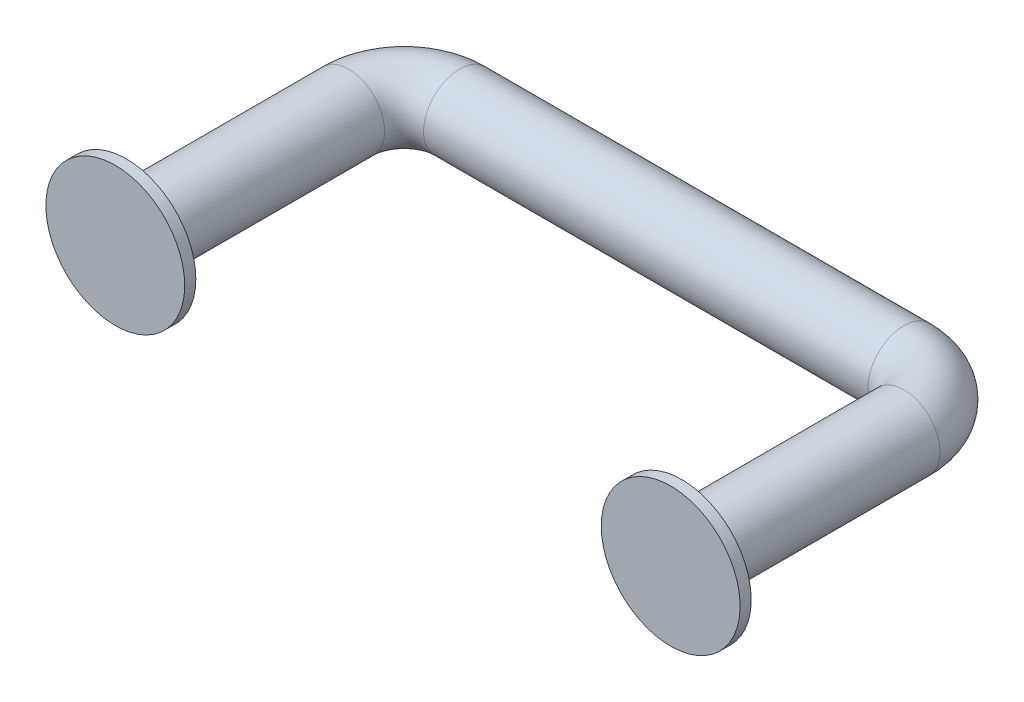
ISO-10303-21;
HEADER;
FILE_DESCRIPTION(('STEP AP214'),'2;1');
FILE_NAME('part.step','',(''),(''),'','','');
FILE_SCHEMA(('AUTOMOTIVE_DESIGN { 1 0 10303 214 1 1 1 1 }'));
ENDSEC;
DATA;
#1=APPLICATION_CONTEXT('core data for automotive mechanical design processes');
#2=APPLICATION_PROTOCOL_DEFINITION('international standard','automotive_design',2000,#1);
#3=PRODUCT_CONTEXT('',#1,'mechanical');
#4=PRODUCT('Part','Part','',(#3));
#5=PRODUCT_RELATED_PRODUCT_CATEGORY('part','',(#4));
#6=PRODUCT_DEFINITION_FORMATION('','',#4);
#7=PRODUCT_DEFINITION_CONTEXT('part definition',#1,'design');
#8=PRODUCT_DEFINITION('design','',#6,#7);
#9=PRODUCT_DEFINITION_SHAPE('','',#8);
#10=(LENGTH_UNIT() NAMED_UNIT(*) SI_UNIT(.MILLI.,.METRE.));
#11=(NAMED_UNIT(*) PLANE_ANGLE_UNIT() SI_UNIT($,.RADIAN.));
#12=(NAMED_UNIT(*) SI_UNIT($,.STERADIAN.) SOLID_ANGLE_UNIT());
#13=UNCERTAINTY_MEASURE_WITH_UNIT(LENGTH_MEASURE(1.E-05),#10,'distance_accuracy_value','');
#14=(GEOMETRIC_REPRESENTATION_CONTEXT(3) GLOBAL_UNCERTAINTY_ASSIGNED_CONTEXT((#13)) GLOBAL_UNIT_ASSIGNED_CONTEXT((#10,
#11,#12)) REPRESENTATION_CONTEXT('',''));
#15=CARTESIAN_POINT('',(0.,0.,0.));
#16=DIRECTION('',(0.,0.,1.));
#17=DIRECTION('',(1.,0.,0.));
#18=AXIS2_PLACEMENT_3D('',#15,#16,#17);
#19=CARTESIAN_POINT('',(50.,0.,52.));
#20=DIRECTION('',(0.,0.,-1.));
#21=DIRECTION('',(-1.,0.,0.));
#22=AXIS2_PLACEMENT_3D('',#19,#20,#21);
#23=CYLINDRICAL_SURFACE('',#22,12.5);
#24=CARTESIAN_POINT('',(50.,0.,52.));
#25=DIRECTION('',(0.,0.,1.));
#26=DIRECTION('',(-1.,0.,0.));
#27=AXIS2_PLACEMENT_3D('',#24,#25,#26);
#28=CIRCLE('',#27,12.5);
#29=CARTESIAN_POINT('',(37.5,0.,52.));
#30=VERTEX_POINT('',#29);
#31=EDGE_CURVE('E12',#30,#30,#28,.T.);
#32=ORIENTED_EDGE('',*,*,#31,.F.);
#33=EDGE_LOOP('',(#32));
#34=FACE_BOUND('',#33,.T.);
#35=CARTESIAN_POINT('',(50.,0.,50.));
#36=DIRECTION('',(0.,0.,1.));
#37=DIRECTION('',(-1.,0.,0.));
#38=AXIS2_PLACEMENT_3D('',#35,#36,#37);
#39=CIRCLE('',#38,12.5);
#40=CARTESIAN_POINT('',(37.5,0.,50.));
#41=VERTEX_POINT('',#40);
#42=EDGE_CURVE('E56',#41,#41,#39,.T.);
#43=ORIENTED_EDGE('',*,*,#42,.T.);
#44=EDGE_LOOP('',(#43));
#45=FACE_BOUND('',#44,.T.);
#46=ADVANCED_FACE('F53',(#34,#45),#23,.T.);
#47=CARTESIAN_POINT('',(50.,0.,52.));
#48=DIRECTION('',(0.,0.,-1.));
#49=DIRECTION('',(-1.,0.,0.));
#50=AXIS2_PLACEMENT_3D('',#47,#48,#49);
#51=PLANE('',#50);
#52=ORIENTED_EDGE('',*,*,#31,.T.);
#53=EDGE_LOOP('',(#52));
#54=FACE_BOUND('',#53,.T.);
#55=ADVANCED_FACE('F68',(#54),#51,.F.);
#56=CARTESIAN_POINT('',(50.,0.,50.));
#57=DIRECTION('',(0.,0.,-1.));
#58=DIRECTION('',(-1.,0.,0.));
#59=AXIS2_PLACEMENT_3D('',#56,#57,#58);
#60=PLANE('',#59);
#61=ORIENTED_EDGE('',*,*,#42,.F.);
#62=EDGE_LOOP('',(#61));
#63=FACE_BOUND('',#62,.T.);
#64=ADVANCED_FACE('F66',(#63),#60,.T.);
#65=CLOSED_SHELL('',(#46,#55,#64));
#66=MANIFOLD_SOLID_BREP('B2',#65);
#67=CARTESIAN_POINT('',(50.,0.,48.8188976377953));
#68=DIRECTION('',(0.,0.,-1.));
#69=DIRECTION('',(-1.,0.,0.));
#70=AXIS2_PLACEMENT_3D('',#67,#68,#69);
#71=PLANE('',#70);
#72=CARTESIAN_POINT('',(50.,0.,48.8188976377953));
#73=DIRECTION('',(0.,0.,-1.));
#74=DIRECTION('',(-1.,0.,0.));
#75=AXIS2_PLACEMENT_3D('',#72,#73,#74);
#76=CIRCLE('',#75,6.5);
#77=CARTESIAN_POINT('',(43.5,0.,48.8188976377953));
#78=VERTEX_POINT('',#77);
#79=EDGE_CURVE('E52',#78,#78,#76,.T.);
#80=ORIENTED_EDGE('',*,*,#79,.F.);
#81=EDGE_LOOP('',(#80));
#82=FACE_BOUND('',#81,.T.);
#83=ADVANCED_FACE('F94',(#82),#71,.F.);
#84=CARTESIAN_POINT('',(-50.,0.,50.));
#85=DIRECTION('',(0.,0.,-1.));
#86=DIRECTION('',(-1.,0.,0.));
#87=AXIS2_PLACEMENT_3D('',#84,#85,#86);
#88=CYLINDRICAL_SURFACE('',#87,6.5);
#89=CARTESIAN_POINT('',(-50.,0.,10.));
#90=DIRECTION('',(0.,0.,1.));
#91=DIRECTION('',(1.,0.,0.));
#92=AXIS2_PLACEMENT_3D('',#89,#90,#91);
#93=CIRCLE('',#92,6.5);
#94=CARTESIAN_POINT('',(-56.5,0.,10.));
#95=VERTEX_POINT('',#94);
#96=EDGE_CURVE('E113',#95,#95,#93,.T.);
#97=ORIENTED_EDGE('',*,*,#96,.T.);
#98=EDGE_LOOP('',(#97));
#99=FACE_BOUND('',#98,.T.);
#100=CARTESIAN_POINT('',(-50.,0.,50.));
#101=DIRECTION('',(0.,0.,1.));
#102=DIRECTION('',(1.,0.,0.));
#103=AXIS2_PLACEMENT_3D('',#100,#101,#102);
#104=CIRCLE('',#103,6.5);
#105=CARTESIAN_POINT('',(-43.5,0.,50.));
#106=VERTEX_POINT('',#105);
#107=EDGE_CURVE('E116',#106,#106,#104,.T.);
#108=ORIENTED_EDGE('',*,*,#107,.F.);
#109=EDGE_LOOP('',(#108));
#110=FACE_BOUND('',#109,.T.);
#111=ADVANCED_FACE('F158',(#99,#110),#88,.T.);
#112=CARTESIAN_POINT('',(-40.,0.,10.));
#113=DIRECTION('',(0.,-1.,0.));
#114=DIRECTION('',(0.,0.,-1.));
#115=AXIS2_PLACEMENT_3D('',#112,#113,#114);
#116=TOROIDAL_SURFACE('',#115,10.,6.5);
#117=CARTESIAN_POINT('',(-40.,0.,0.));
#118=DIRECTION('',(-1.,0.,0.));
#119=DIRECTION('',(0.,0.,1.));
#120=AXIS2_PLACEMENT_3D('',#117,#118,#119);
#121=CIRCLE('',#120,6.5);
#122=CARTESIAN_POINT('',(-40.,0.,-6.5));
#123=VERTEX_POINT('',#122);
#124=EDGE_CURVE('E108',#123,#123,#121,.T.);
#125=CARTESIAN_POINT('',(-40.,0.,10.));
#126=DIRECTION('',(0.,-1.,0.));
#127=DIRECTION('',(0.,0.,-1.));
#128=AXIS2_PLACEMENT_3D('',#125,#126,#127);
#129=CIRCLE('',#128,16.5);
#130=EDGE_CURVE('',#95,#123,#129,.T.);
#131=ORIENTED_EDGE('',*,*,#96,.F.);
#132=ORIENTED_EDGE('',*,*,#124,.T.);
#133=ORIENTED_EDGE('',*,*,#130,.T.);
#134=ORIENTED_EDGE('',*,*,#130,.F.);
#135=EDGE_LOOP('',(#131,#133,#132,#134));
#136=FACE_BOUND('',#135,.T.);
#137=ADVANCED_FACE('F154',(#136),#116,.T.);
#138=CARTESIAN_POINT('',(-40.,0.,0.));
#139=DIRECTION('',(1.,0.,0.));
#140=DIRECTION('',(0.,0.,-1.));
#141=AXIS2_PLACEMENT_3D('',#138,#139,#140);
#142=CYLINDRICAL_SURFACE('',#141,6.5);
#143=CARTESIAN_POINT('',(40.,0.,0.));
#144=DIRECTION('',(-1.,0.,0.));
#145=DIRECTION('',(0.,0.,1.));
#146=AXIS2_PLACEMENT_3D('',#143,#144,#145);
#147=CIRCLE('',#146,6.5);
#148=CARTESIAN_POINT('',(40.,0.,-6.5));
#149=VERTEX_POINT('',#148);
#150=EDGE_CURVE('E104',#149,#149,#147,.T.);
#151=ORIENTED_EDGE('',*,*,#150,.T.);
#152=EDGE_LOOP('',(#151));
#153=FACE_BOUND('',#152,.T.);
#154=ORIENTED_EDGE('',*,*,#124,.F.);
#155=EDGE_LOOP('',(#154));
#156=FACE_BOUND('',#155,.T.);
#157=ADVANCED_FACE('F148',(#153,#156),#142,.T.);
#158=CARTESIAN_POINT('',(40.,0.,10.));
#159=DIRECTION('',(0.,-1.,0.));
#160=DIRECTION('',(0.,0.,-1.));
#161=AXIS2_PLACEMENT_3D('',#158,#159,#160);
#162=TOROIDAL_SURFACE('',#161,10.,6.5);
#163=CARTESIAN_POINT('',(50.,0.,9.99999999999999));
#164=DIRECTION('',(0.,0.,-1.));
#165=DIRECTION('',(-1.,0.,0.));
#166=AXIS2_PLACEMENT_3D('',#163,#164,#165);
#167=CIRCLE('',#166,6.5);
#168=CARTESIAN_POINT('',(56.5,0.,9.99999999999999));
#169=VERTEX_POINT('',#168);
#170=EDGE_CURVE('E100',#169,#169,#167,.T.);
#171=CARTESIAN_POINT('',(40.,0.,10.));
#172=DIRECTION('',(0.,-1.,0.));
#173=DIRECTION('',(0.,0.,-1.));
#174=AXIS2_PLACEMENT_3D('',#171,#172,#173);
#175=CIRCLE('',#174,16.5);
#176=EDGE_CURVE('',#149,#169,#175,.T.);
#177=ORIENTED_EDGE('',*,*,#150,.F.);
#178=ORIENTED_EDGE('',*,*,#170,.T.);
#179=ORIENTED_EDGE('',*,*,#176,.T.);
#180=ORIENTED_EDGE('',*,*,#176,.F.);
#181=EDGE_LOOP('',(#177,#179,#178,#180));
#182=FACE_BOUND('',#181,.T.);
#183=ADVANCED_FACE('F144',(#182),#162,.T.);
#184=CARTESIAN_POINT('',(50.,0.,10.));
#185=DIRECTION('',(0.,0.,1.));
#186=DIRECTION('',(1.,0.,0.));
#187=AXIS2_PLACEMENT_3D('',#184,#185,#186);
#188=CYLINDRICAL_SURFACE('',#187,6.5);
#189=ORIENTED_EDGE('',*,*,#79,.T.);
#190=EDGE_LOOP('',(#189));
#191=FACE_BOUND('',#190,.T.);
#192=ORIENTED_EDGE('',*,*,#170,.F.);
#193=EDGE_LOOP('',(#192));
#194=FACE_BOUND('',#193,.T.);
#195=ADVANCED_FACE('F131',(#191,#194),#188,.T.);
#196=CARTESIAN_POINT('',(-50.,0.,52.));
#197=DIRECTION('',(0.,0.,-1.));
#198=DIRECTION('',(-1.,0.,0.));
#199=AXIS2_PLACEMENT_3D('',#196,#197,#198);
#200=CYLINDRICAL_SURFACE('',#199,12.5);
#201=CARTESIAN_POINT('',(-50.,0.,52.));
#202=DIRECTION('',(0.,0.,1.));
#203=DIRECTION('',(1.,0.,0.));
#204=AXIS2_PLACEMENT_3D('',#201,#202,#203);
#205=CIRCLE('',#204,12.5);
#206=CARTESIAN_POINT('',(-37.5,0.,52.));
#207=VERTEX_POINT('',#206);
#208=EDGE_CURVE('E119',#207,#207,#205,.T.);
#209=ORIENTED_EDGE('',*,*,#208,.F.);
#210=EDGE_LOOP('',(#209));
#211=FACE_BOUND('',#210,.T.);
#212=CARTESIAN_POINT('',(-50.,0.,50.));
#213=DIRECTION('',(0.,0.,1.));
#214=DIRECTION('',(1.,0.,0.));
#215=AXIS2_PLACEMENT_3D('',#212,#213,#214);
#216=CIRCLE('',#215,12.5);
#217=CARTESIAN_POINT('',(-37.5,0.,50.));
#218=VERTEX_POINT('',#217);
#219=EDGE_CURVE('E120',#218,#218,#216,.T.);
#220=ORIENTED_EDGE('',*,*,#219,.T.);
#221=EDGE_LOOP('',(#220));
#222=FACE_BOUND('',#221,.T.);
#223=ADVANCED_FACE('F128',(#211,#222),#200,.T.);
#224=CARTESIAN_POINT('',(-50.,0.,52.));
#225=DIRECTION('',(0.,0.,1.));
#226=DIRECTION('',(1.,0.,0.));
#227=AXIS2_PLACEMENT_3D('',#224,#225,#226);
#228=PLANE('',#227);
#229=ORIENTED_EDGE('',*,*,#208,.T.);
#230=EDGE_LOOP('',(#229));
#231=FACE_BOUND('',#230,.T.);
#232=ADVANCED_FACE('F126',(#231),#228,.T.);
#233=CARTESIAN_POINT('',(-50.,0.,50.));
#234=DIRECTION('',(0.,0.,1.));
#235=DIRECTION('',(1.,0.,0.));
#236=AXIS2_PLACEMENT_3D('',#233,#234,#235);
#237=PLANE('',#236);
#238=ORIENTED_EDGE('',*,*,#107,.T.);
#239=EDGE_LOOP('',(#238));
#240=FACE_BOUND('',#239,.T.);
#241=ORIENTED_EDGE('',*,*,#219,.F.);
#242=EDGE_LOOP('',(#241));
#243=FACE_BOUND('',#242,.T.);
#244=ADVANCED_FACE('F135',(#240,#243),#237,.F.);
#245=CLOSED_SHELL('',(#83,#111,#137,#157,#183,#195,#223,#232,#244));
#246=MANIFOLD_SOLID_BREP('B7',#245);
#247=ADVANCED_BREP_SHAPE_REPRESENTATION('',(#18,#66,#246),#14);
#248=SHAPE_DEFINITION_REPRESENTATION(#9,#247);
ENDSEC;
END-ISO-10303-21;
